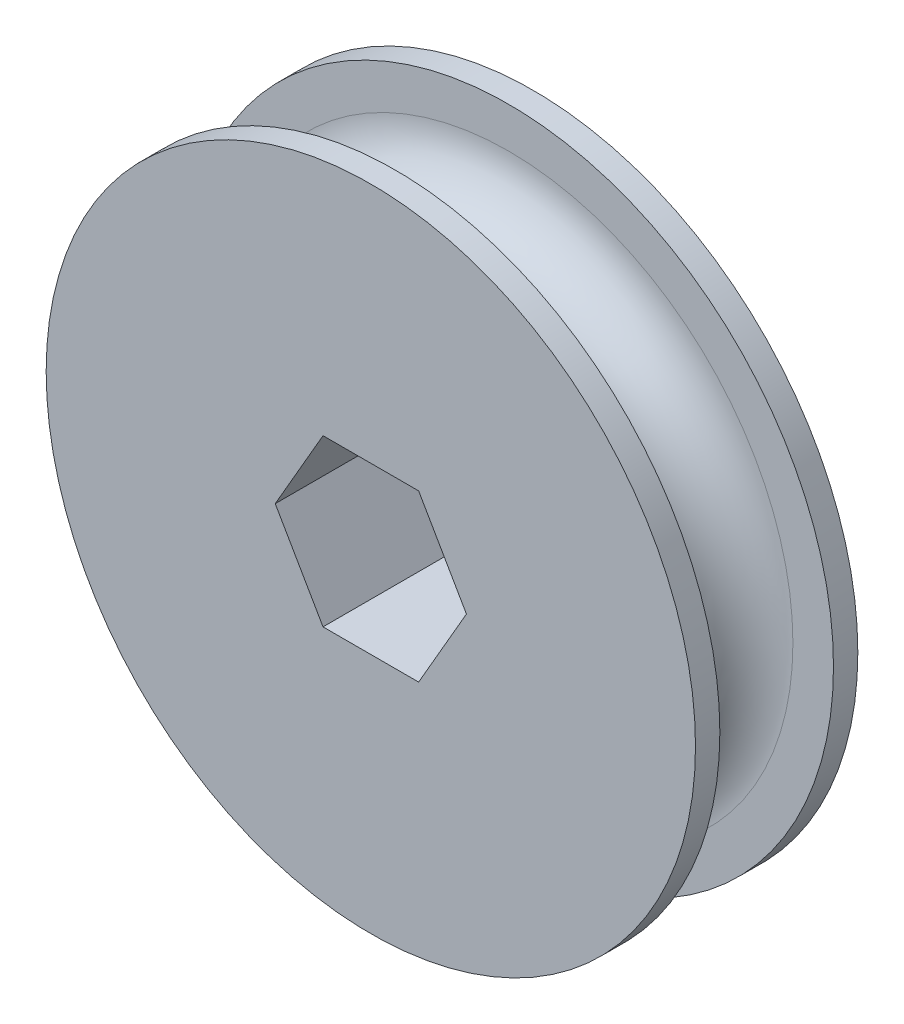
ISO-10303-21;
HEADER;
FILE_DESCRIPTION(('STEP AP214'),'2;1');
FILE_NAME('part.step','',(''),(''),'','','');
FILE_SCHEMA(('AUTOMOTIVE_DESIGN { 1 0 10303 214 1 1 1 1 }'));
ENDSEC;
DATA;
#1=APPLICATION_CONTEXT('core data for automotive mechanical design processes');
#2=APPLICATION_PROTOCOL_DEFINITION('international standard','automotive_design',2000,#1);
#3=PRODUCT_CONTEXT('',#1,'mechanical');
#4=PRODUCT('Part','Part','',(#3));
#5=PRODUCT_RELATED_PRODUCT_CATEGORY('part','',(#4));
#6=PRODUCT_DEFINITION_FORMATION('','',#4);
#7=PRODUCT_DEFINITION_CONTEXT('part definition',#1,'design');
#8=PRODUCT_DEFINITION('design','',#6,#7);
#9=PRODUCT_DEFINITION_SHAPE('','',#8);
#10=(LENGTH_UNIT() NAMED_UNIT(*) SI_UNIT(.MILLI.,.METRE.));
#11=(NAMED_UNIT(*) PLANE_ANGLE_UNIT() SI_UNIT($,.RADIAN.));
#12=(NAMED_UNIT(*) SI_UNIT($,.STERADIAN.) SOLID_ANGLE_UNIT());
#13=UNCERTAINTY_MEASURE_WITH_UNIT(LENGTH_MEASURE(1.E-05),#10,'distance_accuracy_value','');
#14=(GEOMETRIC_REPRESENTATION_CONTEXT(3) GLOBAL_UNCERTAINTY_ASSIGNED_CONTEXT((#13)) GLOBAL_UNIT_ASSIGNED_CONTEXT((#10,
#11,#12)) REPRESENTATION_CONTEXT('',''));
#15=CARTESIAN_POINT('',(0.,0.,0.));
#16=DIRECTION('',(0.,0.,1.));
#17=DIRECTION('',(1.,0.,0.));
#18=AXIS2_PLACEMENT_3D('',#15,#16,#17);
#19=CARTESIAN_POINT('',(0.,0.,6.35));
#20=DIRECTION('',(0.,0.,-1.));
#21=DIRECTION('',(-1.,0.,0.));
#22=AXIS2_PLACEMENT_3D('',#19,#20,#21);
#23=CYLINDRICAL_SURFACE('',#22,25.4);
#24=CARTESIAN_POINT('',(0.,0.,-6.35));
#25=DIRECTION('',(0.,0.,1.));
#26=DIRECTION('',(1.,0.,0.));
#27=AXIS2_PLACEMENT_3D('',#24,#25,#26);
#28=CIRCLE('',#27,25.4);
#29=CARTESIAN_POINT('',(25.4,0.,-6.35));
#30=VERTEX_POINT('',#29);
#31=EDGE_CURVE('E36',#30,#30,#28,.T.);
#32=ORIENTED_EDGE('',*,*,#31,.T.);
#33=EDGE_LOOP('',(#32));
#34=FACE_BOUND('',#33,.T.);
#35=CARTESIAN_POINT('',(0.,0.,-4.445));
#36=DIRECTION('',(0.,0.,1.));
#37=DIRECTION('',(1.,0.,0.));
#38=AXIS2_PLACEMENT_3D('',#35,#36,#37);
#39=CIRCLE('',#38,25.4);
#40=CARTESIAN_POINT('',(25.4,0.,-4.445));
#41=VERTEX_POINT('',#40);
#42=EDGE_CURVE('E143',#41,#41,#39,.T.);
#43=ORIENTED_EDGE('',*,*,#42,.F.);
#44=EDGE_LOOP('',(#43));
#45=FACE_BOUND('',#44,.T.);
#46=ADVANCED_FACE('F33',(#34,#45),#23,.T.);
#47=CARTESIAN_POINT('',(0.,0.,-6.35));
#48=DIRECTION('',(0.,0.,1.));
#49=DIRECTION('',(1.,0.,0.));
#50=AXIS2_PLACEMENT_3D('',#47,#48,#49);
#51=PLANE('',#50);
#52=DIRECTION('',(0.499999999999998,0.86602540378444,0.));
#53=VECTOR('',#52,1.);
#54=CARTESIAN_POINT('',(-7.4789953870824,0.,-6.35));
#55=LINE('',#54,#53);
#56=CARTESIAN_POINT('',(-7.4789953870824,0.,-6.35));
#57=VERTEX_POINT('',#56);
#58=CARTESIAN_POINT('',(-3.73949769354122,6.477,-6.35));
#59=VERTEX_POINT('',#58);
#60=EDGE_CURVE('E118',#57,#59,#55,.T.);
#61=ORIENTED_EDGE('',*,*,#60,.F.);
#62=DIRECTION('',(-0.499999999999998,0.86602540378444,0.));
#63=VECTOR('',#62,1.);
#64=CARTESIAN_POINT('',(-3.73949769354122,-6.477,-6.35));
#65=LINE('',#64,#63);
#66=CARTESIAN_POINT('',(-3.73949769354122,-6.477,-6.35));
#67=VERTEX_POINT('',#66);
#68=EDGE_CURVE('E47',#67,#57,#65,.T.);
#69=ORIENTED_EDGE('',*,*,#68,.F.);
#70=DIRECTION('',(-1.,0.,0.));
#71=VECTOR('',#70,1.);
#72=CARTESIAN_POINT('',(3.73949769354122,-6.477,-6.35));
#73=LINE('',#72,#71);
#74=CARTESIAN_POINT('',(3.73949769354122,-6.477,-6.35));
#75=VERTEX_POINT('',#74);
#76=EDGE_CURVE('E104',#75,#67,#73,.T.);
#77=ORIENTED_EDGE('',*,*,#76,.F.);
#78=DIRECTION('',(-0.499999999999998,-0.86602540378444,0.));
#79=VECTOR('',#78,1.);
#80=CARTESIAN_POINT('',(7.4789953870824,0.,-6.35));
#81=LINE('',#80,#79);
#82=CARTESIAN_POINT('',(7.4789953870824,0.,-6.35));
#83=VERTEX_POINT('',#82);
#84=EDGE_CURVE('E107',#83,#75,#81,.T.);
#85=ORIENTED_EDGE('',*,*,#84,.F.);
#86=DIRECTION('',(0.499999999999998,-0.86602540378444,0.));
#87=VECTOR('',#86,1.);
#88=CARTESIAN_POINT('',(3.73949769354122,6.477,-6.35));
#89=LINE('',#88,#87);
#90=CARTESIAN_POINT('',(3.73949769354122,6.477,-6.35));
#91=VERTEX_POINT('',#90);
#92=EDGE_CURVE('E123',#91,#83,#89,.T.);
#93=ORIENTED_EDGE('',*,*,#92,.F.);
#94=DIRECTION('',(1.,0.,0.));
#95=VECTOR('',#94,1.);
#96=CARTESIAN_POINT('',(-3.73949769354122,6.477,-6.35));
#97=LINE('',#96,#95);
#98=EDGE_CURVE('E120',#59,#91,#97,.T.);
#99=ORIENTED_EDGE('',*,*,#98,.F.);
#100=EDGE_LOOP('',(#61,#69,#77,#85,#93,#99));
#101=FACE_BOUND('',#100,.T.);
#102=ORIENTED_EDGE('',*,*,#31,.F.);
#103=EDGE_LOOP('',(#102));
#104=FACE_BOUND('',#103,.T.);
#105=ADVANCED_FACE('F155',(#101,#104),#51,.F.);
#106=CARTESIAN_POINT('',(0.,0.,0.));
#107=DIRECTION('',(0.,0.,1.));
#108=DIRECTION('',(1.,0.,0.));
#109=AXIS2_PLACEMENT_3D('',#106,#107,#108);
#110=TOROIDAL_SURFACE('',#109,22.225,4.445);
#111=CARTESIAN_POINT('',(0.,0.,-4.445));
#112=DIRECTION('',(0.,0.,1.));
#113=DIRECTION('',(1.,0.,0.));
#114=AXIS2_PLACEMENT_3D('',#111,#112,#113);
#115=CIRCLE('',#114,22.225);
#116=CARTESIAN_POINT('',(22.225,0.,-4.445));
#117=VERTEX_POINT('',#116);
#118=EDGE_CURVE('E146',#117,#117,#115,.T.);
#119=ORIENTED_EDGE('',*,*,#118,.T.);
#120=EDGE_LOOP('',(#119));
#121=FACE_BOUND('',#120,.T.);
#122=CARTESIAN_POINT('',(0.,0.,4.445));
#123=DIRECTION('',(0.,0.,1.));
#124=DIRECTION('',(1.,0.,0.));
#125=AXIS2_PLACEMENT_3D('',#122,#123,#124);
#126=CIRCLE('',#125,22.225);
#127=CARTESIAN_POINT('',(22.225,0.,4.445));
#128=VERTEX_POINT('',#127);
#129=EDGE_CURVE('E130',#128,#128,#126,.T.);
#130=ORIENTED_EDGE('',*,*,#129,.F.);
#131=EDGE_LOOP('',(#130));
#132=FACE_BOUND('',#131,.T.);
#133=ADVANCED_FACE('F157',(#121,#132),#110,.F.);
#134=CARTESIAN_POINT('',(-22.225,0.,-4.445));
#135=DIRECTION('',(0.,0.,1.));
#136=DIRECTION('',(1.,0.,0.));
#137=AXIS2_PLACEMENT_3D('',#134,#135,#136);
#138=PLANE('',#137);
#139=ORIENTED_EDGE('',*,*,#42,.T.);
#140=EDGE_LOOP('',(#139));
#141=FACE_BOUND('',#140,.T.);
#142=ORIENTED_EDGE('',*,*,#118,.F.);
#143=EDGE_LOOP('',(#142));
#144=FACE_BOUND('',#143,.T.);
#145=ADVANCED_FACE('F163',(#141,#144),#138,.T.);
#146=CARTESIAN_POINT('',(-22.225,0.,4.445));
#147=DIRECTION('',(0.,0.,-1.));
#148=DIRECTION('',(-1.,0.,0.));
#149=AXIS2_PLACEMENT_3D('',#146,#147,#148);
#150=PLANE('',#149);
#151=ORIENTED_EDGE('',*,*,#129,.T.);
#152=EDGE_LOOP('',(#151));
#153=FACE_BOUND('',#152,.T.);
#154=CARTESIAN_POINT('',(0.,0.,4.445));
#155=DIRECTION('',(0.,0.,1.));
#156=DIRECTION('',(1.,0.,0.));
#157=AXIS2_PLACEMENT_3D('',#154,#155,#156);
#158=CIRCLE('',#157,25.4);
#159=CARTESIAN_POINT('',(25.4,0.,4.445));
#160=VERTEX_POINT('',#159);
#161=EDGE_CURVE('E140',#160,#160,#158,.T.);
#162=ORIENTED_EDGE('',*,*,#161,.F.);
#163=EDGE_LOOP('',(#162));
#164=FACE_BOUND('',#163,.T.);
#165=ADVANCED_FACE('F168',(#153,#164),#150,.T.);
#166=CARTESIAN_POINT('',(0.,0.,6.35));
#167=DIRECTION('',(0.,0.,1.));
#168=DIRECTION('',(1.,0.,0.));
#169=AXIS2_PLACEMENT_3D('',#166,#167,#168);
#170=PLANE('',#169);
#171=DIRECTION('',(-0.499999999999998,0.86602540378444,0.));
#172=VECTOR('',#171,1.);
#173=CARTESIAN_POINT('',(-3.73949769354122,-6.477,6.35));
#174=LINE('',#173,#172);
#175=CARTESIAN_POINT('',(-3.73949769354122,-6.477,6.35));
#176=VERTEX_POINT('',#175);
#177=CARTESIAN_POINT('',(-7.4789953870824,0.,6.35));
#178=VERTEX_POINT('',#177);
#179=EDGE_CURVE('E87',#176,#178,#174,.T.);
#180=ORIENTED_EDGE('',*,*,#179,.T.);
#181=DIRECTION('',(0.499999999999998,0.86602540378444,0.));
#182=VECTOR('',#181,1.);
#183=CARTESIAN_POINT('',(-7.4789953870824,0.,6.35));
#184=LINE('',#183,#182);
#185=CARTESIAN_POINT('',(-3.73949769354122,6.477,6.35));
#186=VERTEX_POINT('',#185);
#187=EDGE_CURVE('E96',#178,#186,#184,.T.);
#188=ORIENTED_EDGE('',*,*,#187,.T.);
#189=DIRECTION('',(1.,0.,0.));
#190=VECTOR('',#189,1.);
#191=CARTESIAN_POINT('',(-3.73949769354122,6.477,6.35));
#192=LINE('',#191,#190);
#193=CARTESIAN_POINT('',(3.73949769354122,6.477,6.35));
#194=VERTEX_POINT('',#193);
#195=EDGE_CURVE('E55',#186,#194,#192,.T.);
#196=ORIENTED_EDGE('',*,*,#195,.T.);
#197=DIRECTION('',(0.499999999999998,-0.86602540378444,0.));
#198=VECTOR('',#197,1.);
#199=CARTESIAN_POINT('',(3.73949769354122,6.477,6.35));
#200=LINE('',#199,#198);
#201=CARTESIAN_POINT('',(7.4789953870824,0.,6.35));
#202=VERTEX_POINT('',#201);
#203=EDGE_CURVE('E111',#194,#202,#200,.T.);
#204=ORIENTED_EDGE('',*,*,#203,.T.);
#205=DIRECTION('',(-0.499999999999998,-0.86602540378444,0.));
#206=VECTOR('',#205,1.);
#207=CARTESIAN_POINT('',(7.4789953870824,0.,6.35));
#208=LINE('',#207,#206);
#209=CARTESIAN_POINT('',(3.73949769354122,-6.477,6.35));
#210=VERTEX_POINT('',#209);
#211=EDGE_CURVE('E114',#202,#210,#208,.T.);
#212=ORIENTED_EDGE('',*,*,#211,.T.);
#213=DIRECTION('',(-1.,0.,0.));
#214=VECTOR('',#213,1.);
#215=CARTESIAN_POINT('',(3.73949769354122,-6.477,6.35));
#216=LINE('',#215,#214);
#217=EDGE_CURVE('E93',#210,#176,#216,.T.);
#218=ORIENTED_EDGE('',*,*,#217,.T.);
#219=EDGE_LOOP('',(#180,#188,#196,#204,#212,#218));
#220=FACE_BOUND('',#219,.T.);
#221=CARTESIAN_POINT('',(0.,0.,6.35));
#222=DIRECTION('',(0.,0.,1.));
#223=DIRECTION('',(1.,0.,0.));
#224=AXIS2_PLACEMENT_3D('',#221,#222,#223);
#225=CIRCLE('',#224,25.4);
#226=CARTESIAN_POINT('',(25.4,0.,6.35));
#227=VERTEX_POINT('',#226);
#228=EDGE_CURVE('E11',#227,#227,#225,.T.);
#229=ORIENTED_EDGE('',*,*,#228,.T.);
#230=EDGE_LOOP('',(#229));
#231=FACE_BOUND('',#230,.T.);
#232=ADVANCED_FACE('F100',(#220,#231),#170,.T.);
#233=ORIENTED_EDGE('',*,*,#228,.F.);
#234=EDGE_LOOP('',(#233));
#235=FACE_BOUND('',#234,.T.);
#236=ORIENTED_EDGE('',*,*,#161,.T.);
#237=EDGE_LOOP('',(#236));
#238=FACE_BOUND('',#237,.T.);
#239=ADVANCED_FACE('F165',(#235,#238),#23,.T.);
#240=CARTESIAN_POINT('',(-3.73949769354122,-6.477,6.35));
#241=DIRECTION('',(-0.86602540378444,-0.499999999999998,0.));
#242=DIRECTION('',(0.499999999999998,-0.86602540378444,0.));
#243=AXIS2_PLACEMENT_3D('',#240,#241,#242);
#244=PLANE('',#243);
#245=ORIENTED_EDGE('',*,*,#68,.T.);
#246=DIRECTION('',(0.,0.,-1.));
#247=VECTOR('',#246,1.);
#248=CARTESIAN_POINT('',(-7.4789953870824,0.,6.35));
#249=LINE('',#248,#247);
#250=EDGE_CURVE('E83',#178,#57,#249,.T.);
#251=ORIENTED_EDGE('',*,*,#250,.F.);
#252=ORIENTED_EDGE('',*,*,#179,.F.);
#253=DIRECTION('',(0.,0.,-1.));
#254=VECTOR('',#253,1.);
#255=CARTESIAN_POINT('',(-3.73949769354122,-6.477,6.35));
#256=LINE('',#255,#254);
#257=EDGE_CURVE('E128',#176,#67,#256,.T.);
#258=ORIENTED_EDGE('',*,*,#257,.T.);
#259=EDGE_LOOP('',(#245,#251,#252,#258));
#260=FACE_BOUND('',#259,.T.);
#261=ADVANCED_FACE('F85',(#260),#244,.F.);
#262=CARTESIAN_POINT('',(3.73949769354122,-6.477,6.35));
#263=DIRECTION('',(0.,-1.,0.));
#264=DIRECTION('',(0.,0.,-1.));
#265=AXIS2_PLACEMENT_3D('',#262,#263,#264);
#266=PLANE('',#265);
#267=ORIENTED_EDGE('',*,*,#76,.T.);
#268=ORIENTED_EDGE('',*,*,#257,.F.);
#269=ORIENTED_EDGE('',*,*,#217,.F.);
#270=DIRECTION('',(0.,0.,-1.));
#271=VECTOR('',#270,1.);
#272=CARTESIAN_POINT('',(3.73949769354122,-6.477,6.35));
#273=LINE('',#272,#271);
#274=EDGE_CURVE('E131',#210,#75,#273,.T.);
#275=ORIENTED_EDGE('',*,*,#274,.T.);
#276=EDGE_LOOP('',(#267,#268,#269,#275));
#277=FACE_BOUND('',#276,.T.);
#278=ADVANCED_FACE('F178',(#277),#266,.F.);
#279=CARTESIAN_POINT('',(7.4789953870824,0.,6.35));
#280=DIRECTION('',(0.86602540378444,-0.499999999999998,0.));
#281=DIRECTION('',(0.499999999999998,0.86602540378444,0.));
#282=AXIS2_PLACEMENT_3D('',#279,#280,#281);
#283=PLANE('',#282);
#284=ORIENTED_EDGE('',*,*,#84,.T.);
#285=ORIENTED_EDGE('',*,*,#274,.F.);
#286=ORIENTED_EDGE('',*,*,#211,.F.);
#287=DIRECTION('',(0.,0.,-1.));
#288=VECTOR('',#287,1.);
#289=CARTESIAN_POINT('',(7.4789953870824,0.,6.35));
#290=LINE('',#289,#288);
#291=EDGE_CURVE('E133',#202,#83,#290,.T.);
#292=ORIENTED_EDGE('',*,*,#291,.T.);
#293=EDGE_LOOP('',(#284,#285,#286,#292));
#294=FACE_BOUND('',#293,.T.);
#295=ADVANCED_FACE('F187',(#294),#283,.F.);
#296=CARTESIAN_POINT('',(3.73949769354122,6.477,6.35));
#297=DIRECTION('',(0.86602540378444,0.499999999999998,0.));
#298=DIRECTION('',(-0.499999999999998,0.86602540378444,0.));
#299=AXIS2_PLACEMENT_3D('',#296,#297,#298);
#300=PLANE('',#299);
#301=ORIENTED_EDGE('',*,*,#92,.T.);
#302=ORIENTED_EDGE('',*,*,#291,.F.);
#303=ORIENTED_EDGE('',*,*,#203,.F.);
#304=DIRECTION('',(0.,0.,-1.));
#305=VECTOR('',#304,1.);
#306=CARTESIAN_POINT('',(3.73949769354122,6.477,6.35));
#307=LINE('',#306,#305);
#308=EDGE_CURVE('E135',#194,#91,#307,.T.);
#309=ORIENTED_EDGE('',*,*,#308,.T.);
#310=EDGE_LOOP('',(#301,#302,#303,#309));
#311=FACE_BOUND('',#310,.T.);
#312=ADVANCED_FACE('F184',(#311),#300,.F.);
#313=CARTESIAN_POINT('',(-3.73949769354122,6.477,6.35));
#314=DIRECTION('',(0.,1.,0.));
#315=DIRECTION('',(0.,0.,1.));
#316=AXIS2_PLACEMENT_3D('',#313,#314,#315);
#317=PLANE('',#316);
#318=ORIENTED_EDGE('',*,*,#98,.T.);
#319=ORIENTED_EDGE('',*,*,#308,.F.);
#320=ORIENTED_EDGE('',*,*,#195,.F.);
#321=DIRECTION('',(0.,0.,-1.));
#322=VECTOR('',#321,1.);
#323=CARTESIAN_POINT('',(-3.73949769354122,6.477,6.35));
#324=LINE('',#323,#322);
#325=EDGE_CURVE('E92',#186,#59,#324,.T.);
#326=ORIENTED_EDGE('',*,*,#325,.T.);
#327=EDGE_LOOP('',(#318,#319,#320,#326));
#328=FACE_BOUND('',#327,.T.);
#329=ADVANCED_FACE('F181',(#328),#317,.F.);
#330=CARTESIAN_POINT('',(-7.4789953870824,0.,6.35));
#331=DIRECTION('',(-0.86602540378444,0.499999999999998,0.));
#332=DIRECTION('',(-0.499999999999998,-0.86602540378444,0.));
#333=AXIS2_PLACEMENT_3D('',#330,#331,#332);
#334=PLANE('',#333);
#335=ORIENTED_EDGE('',*,*,#60,.T.);
#336=ORIENTED_EDGE('',*,*,#325,.F.);
#337=ORIENTED_EDGE('',*,*,#187,.F.);
#338=ORIENTED_EDGE('',*,*,#250,.T.);
#339=EDGE_LOOP('',(#335,#336,#337,#338));
#340=FACE_BOUND('',#339,.T.);
#341=ADVANCED_FACE('F97',(#340),#334,.F.);
#342=CLOSED_SHELL('',(#46,#105,#133,#145,#165,#232,#239,#261,#278,#295,#312,#329,#341));
#343=MANIFOLD_SOLID_BREP('B2',#342);
#344=ADVANCED_BREP_SHAPE_REPRESENTATION('',(#18,#343),#14);
#345=SHAPE_DEFINITION_REPRESENTATION(#9,#344);
ENDSEC;
END-ISO-10303-21;
